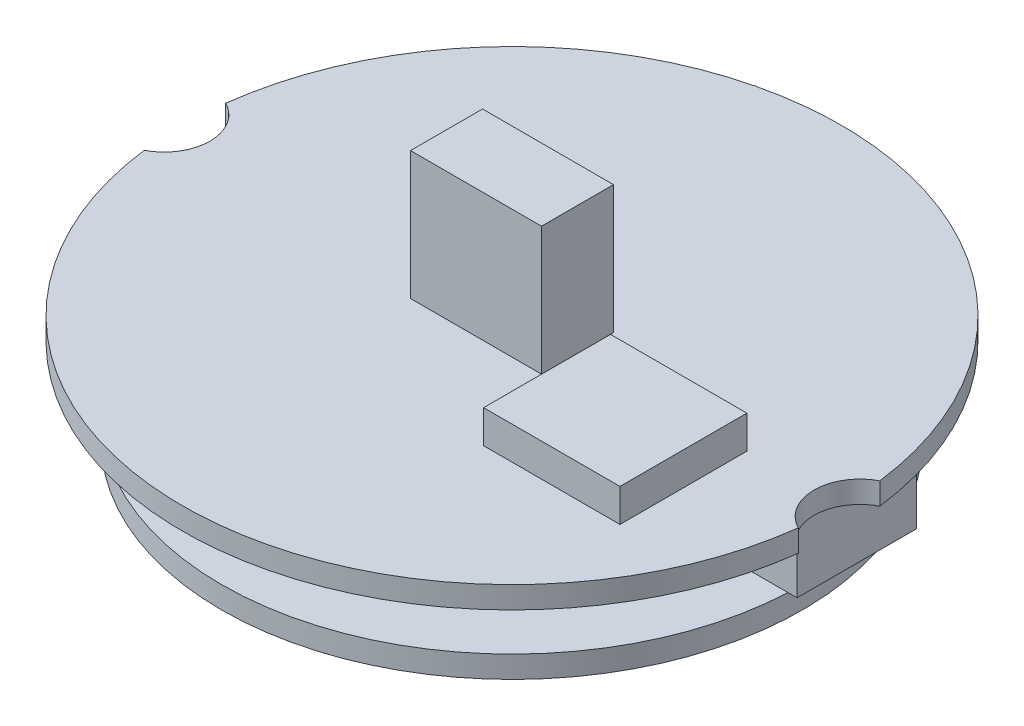
ISO-10303-21;
HEADER;
FILE_DESCRIPTION(('STEP AP214'),'2;1');
FILE_NAME('part.step','',(''),(''),'','','');
FILE_SCHEMA(('AUTOMOTIVE_DESIGN { 1 0 10303 214 1 1 1 1 }'));
ENDSEC;
DATA;
#1=APPLICATION_CONTEXT('core data for automotive mechanical design processes');
#2=APPLICATION_PROTOCOL_DEFINITION('international standard','automotive_design',2000,#1);
#3=PRODUCT_CONTEXT('',#1,'mechanical');
#4=PRODUCT('Part','Part','',(#3));
#5=PRODUCT_RELATED_PRODUCT_CATEGORY('part','',(#4));
#6=PRODUCT_DEFINITION_FORMATION('','',#4);
#7=PRODUCT_DEFINITION_CONTEXT('part definition',#1,'design');
#8=PRODUCT_DEFINITION('design','',#6,#7);
#9=PRODUCT_DEFINITION_SHAPE('','',#8);
#10=(LENGTH_UNIT() NAMED_UNIT(*) SI_UNIT(.MILLI.,.METRE.));
#11=(NAMED_UNIT(*) PLANE_ANGLE_UNIT() SI_UNIT($,.RADIAN.));
#12=(NAMED_UNIT(*) SI_UNIT($,.STERADIAN.) SOLID_ANGLE_UNIT());
#13=UNCERTAINTY_MEASURE_WITH_UNIT(LENGTH_MEASURE(1.E-05),#10,'distance_accuracy_value','');
#14=(GEOMETRIC_REPRESENTATION_CONTEXT(3) GLOBAL_UNCERTAINTY_ASSIGNED_CONTEXT((#13)) GLOBAL_UNIT_ASSIGNED_CONTEXT((#10,
#11,#12)) REPRESENTATION_CONTEXT('',''));
#15=CARTESIAN_POINT('',(0.,0.,0.));
#16=DIRECTION('',(0.,0.,1.));
#17=DIRECTION('',(1.,0.,0.));
#18=AXIS2_PLACEMENT_3D('',#15,#16,#17);
#19=CARTESIAN_POINT('',(0.,3.,0.));
#20=DIRECTION('',(0.,1.,0.));
#21=DIRECTION('',(0.,0.,1.));
#22=AXIS2_PLACEMENT_3D('',#19,#20,#21);
#23=PLANE('',#22);
#24=CARTESIAN_POINT('',(9.5,3.,0.));
#25=DIRECTION('',(0.,1.,0.));
#26=DIRECTION('',(0.,0.,1.));
#27=AXIS2_PLACEMENT_3D('',#24,#25,#26);
#28=CIRCLE('',#27,1.25);
#29=CARTESIAN_POINT('',(8.93092105263158,3.,-1.11294615847401));
#30=VERTEX_POINT('',#29);
#31=CARTESIAN_POINT('',(8.93092105263158,3.,1.11294615847401));
#32=VERTEX_POINT('',#31);
#33=EDGE_CURVE('E189',#30,#32,#28,.T.);
#34=ORIENTED_EDGE('',*,*,#33,.F.);
#35=CARTESIAN_POINT('',(0.,3.,0.));
#36=DIRECTION('',(0.,1.,0.));
#37=DIRECTION('',(0.,0.,1.));
#38=AXIS2_PLACEMENT_3D('',#35,#36,#37);
#39=CIRCLE('',#38,9.);
#40=CARTESIAN_POINT('',(-8.93092105263158,3.,-1.11294615847401));
#41=VERTEX_POINT('',#40);
#42=EDGE_CURVE('E192',#30,#41,#39,.T.);
#43=ORIENTED_EDGE('',*,*,#42,.T.);
#44=CARTESIAN_POINT('',(-9.5,3.,0.));
#45=DIRECTION('',(0.,1.,0.));
#46=DIRECTION('',(0.,0.,1.));
#47=AXIS2_PLACEMENT_3D('',#44,#45,#46);
#48=CIRCLE('',#47,1.25);
#49=CARTESIAN_POINT('',(-8.93092105263158,3.,1.11294615847401));
#50=VERTEX_POINT('',#49);
#51=EDGE_CURVE('E195',#50,#41,#48,.T.);
#52=ORIENTED_EDGE('',*,*,#51,.F.);
#53=EDGE_CURVE('E196',#50,#32,#39,.T.);
#54=ORIENTED_EDGE('',*,*,#53,.T.);
#55=EDGE_LOOP('',(#34,#43,#52,#54));
#56=FACE_BOUND('',#55,.T.);
#57=DIRECTION('',(1.,0.,0.));
#58=VECTOR('',#57,1.);
#59=CARTESIAN_POINT('',(2.69022743306346,3.,3.46625457721637));
#60=LINE('',#59,#58);
#61=CARTESIAN_POINT('',(2.69022743306346,3.,3.46625457721637));
#62=VERTEX_POINT('',#61);
#63=CARTESIAN_POINT('',(6.41515772499748,3.,3.46625457721637));
#64=VERTEX_POINT('',#63);
#65=EDGE_CURVE('E160',#62,#64,#60,.T.);
#66=ORIENTED_EDGE('',*,*,#65,.F.);
#67=DIRECTION('',(0.,0.,1.));
#68=VECTOR('',#67,1.);
#69=CARTESIAN_POINT('',(2.69022743306346,3.,0.));
#70=LINE('',#69,#68);
#71=CARTESIAN_POINT('',(2.69022743306346,3.,0.));
#72=VERTEX_POINT('',#71);
#73=EDGE_CURVE('E157',#72,#62,#70,.T.);
#74=ORIENTED_EDGE('',*,*,#73,.F.);
#75=DIRECTION('',(-1.,0.,0.));
#76=VECTOR('',#75,1.);
#77=CARTESIAN_POINT('',(2.69022743306346,3.,0.));
#78=LINE('',#77,#76);
#79=CARTESIAN_POINT('',(6.41515772499748,3.,0.));
#80=VERTEX_POINT('',#79);
#81=EDGE_CURVE('E169',#80,#72,#78,.T.);
#82=ORIENTED_EDGE('',*,*,#81,.F.);
#83=DIRECTION('',(0.,0.,-1.));
#84=VECTOR('',#83,1.);
#85=CARTESIAN_POINT('',(6.41515772499748,3.,0.));
#86=LINE('',#85,#84);
#87=EDGE_CURVE('E177',#64,#80,#86,.T.);
#88=ORIENTED_EDGE('',*,*,#87,.F.);
#89=EDGE_LOOP('',(#66,#74,#82,#88));
#90=FACE_BOUND('',#89,.T.);
#91=DIRECTION('',(-1.,0.,0.));
#92=VECTOR('',#91,1.);
#93=CARTESIAN_POINT('',(-1.78855779890483,3.,-0.982967715927025));
#94=LINE('',#93,#92);
#95=CARTESIAN_POINT('',(1.78855779890483,3.,-0.982967715927025));
#96=VERTEX_POINT('',#95);
#97=CARTESIAN_POINT('',(-1.78855779890483,3.,-0.982967715927025));
#98=VERTEX_POINT('',#97);
#99=EDGE_CURVE('E376',#96,#98,#94,.T.);
#100=ORIENTED_EDGE('',*,*,#99,.F.);
#101=DIRECTION('',(0.,0.,-1.));
#102=VECTOR('',#101,1.);
#103=CARTESIAN_POINT('',(1.78855779890483,3.,-0.982967715927025));
#104=LINE('',#103,#102);
#105=CARTESIAN_POINT('',(1.78855779890483,3.,0.982967715927025));
#106=VERTEX_POINT('',#105);
#107=EDGE_CURVE('E155',#106,#96,#104,.T.);
#108=ORIENTED_EDGE('',*,*,#107,.F.);
#109=DIRECTION('',(1.,0.,0.));
#110=VECTOR('',#109,1.);
#111=CARTESIAN_POINT('',(-1.78855779890483,3.,0.982967715927025));
#112=LINE('',#111,#110);
#113=CARTESIAN_POINT('',(-1.78855779890483,3.,0.982967715927025));
#114=VERTEX_POINT('',#113);
#115=EDGE_CURVE('E151',#114,#106,#112,.T.);
#116=ORIENTED_EDGE('',*,*,#115,.F.);
#117=DIRECTION('',(0.,0.,1.));
#118=VECTOR('',#117,1.);
#119=CARTESIAN_POINT('',(-1.78855779890483,3.,-0.982967715927025));
#120=LINE('',#119,#118);
#121=EDGE_CURVE('E373',#98,#114,#120,.T.);
#122=ORIENTED_EDGE('',*,*,#121,.F.);
#123=EDGE_LOOP('',(#100,#108,#116,#122));
#124=FACE_BOUND('',#123,.T.);
#125=ADVANCED_FACE('F43',(#56,#90,#124),#23,.T.);
#126=CARTESIAN_POINT('',(9.5,3.,0.));
#127=DIRECTION('',(0.,-1.,0.));
#128=DIRECTION('',(0.,0.,-1.));
#129=AXIS2_PLACEMENT_3D('',#126,#127,#128);
#130=CYLINDRICAL_SURFACE('',#129,1.25);
#131=CARTESIAN_POINT('',(9.5,2.4,0.));
#132=DIRECTION('',(0.,1.,0.));
#133=DIRECTION('',(0.,0.,1.));
#134=AXIS2_PLACEMENT_3D('',#131,#132,#133);
#135=CIRCLE('',#134,1.25);
#136=CARTESIAN_POINT('',(8.93092105263158,2.4,-1.11294615847401));
#137=VERTEX_POINT('',#136);
#138=CARTESIAN_POINT('',(8.93092105263158,2.4,1.11294615847401));
#139=VERTEX_POINT('',#138);
#140=EDGE_CURVE('E188',#137,#139,#135,.T.);
#141=ORIENTED_EDGE('',*,*,#140,.F.);
#142=DIRECTION('',(0.,-1.,0.));
#143=VECTOR('',#142,1.);
#144=CARTESIAN_POINT('',(8.93092105263158,3.,-1.11294615847401));
#145=LINE('',#144,#143);
#146=EDGE_CURVE('E12',#30,#137,#145,.T.);
#147=ORIENTED_EDGE('',*,*,#146,.F.);
#148=ORIENTED_EDGE('',*,*,#33,.T.);
#149=DIRECTION('',(0.,-1.,0.));
#150=VECTOR('',#149,1.);
#151=CARTESIAN_POINT('',(8.93092105263158,3.,1.11294615847401));
#152=LINE('',#151,#150);
#153=EDGE_CURVE('E207',#32,#139,#152,.T.);
#154=ORIENTED_EDGE('',*,*,#153,.T.);
#155=EDGE_LOOP('',(#141,#147,#148,#154));
#156=FACE_BOUND('',#155,.T.);
#157=ADVANCED_FACE('F45',(#156),#130,.F.);
#158=CARTESIAN_POINT('',(0.,3.,0.));
#159=DIRECTION('',(0.,-1.,0.));
#160=DIRECTION('',(0.,0.,-1.));
#161=AXIS2_PLACEMENT_3D('',#158,#159,#160);
#162=CYLINDRICAL_SURFACE('',#161,9.);
#163=CARTESIAN_POINT('',(0.,2.4,0.));
#164=DIRECTION('',(0.,1.,0.));
#165=DIRECTION('',(0.,0.,1.));
#166=AXIS2_PLACEMENT_3D('',#163,#164,#165);
#167=CIRCLE('',#166,9.);
#168=CARTESIAN_POINT('',(-8.93092105263158,2.4,-1.11294615847401));
#169=VERTEX_POINT('',#168);
#170=EDGE_CURVE('E201',#137,#169,#167,.T.);
#171=ORIENTED_EDGE('',*,*,#170,.T.);
#172=DIRECTION('',(0.,-1.,0.));
#173=VECTOR('',#172,1.);
#174=CARTESIAN_POINT('',(-8.93092105263158,3.,-1.11294615847401));
#175=LINE('',#174,#173);
#176=EDGE_CURVE('E51',#41,#169,#175,.T.);
#177=ORIENTED_EDGE('',*,*,#176,.F.);
#178=ORIENTED_EDGE('',*,*,#42,.F.);
#179=ORIENTED_EDGE('',*,*,#146,.T.);
#180=EDGE_LOOP('',(#171,#177,#178,#179));
#181=FACE_BOUND('',#180,.T.);
#182=ADVANCED_FACE('F218',(#181),#162,.T.);
#183=CARTESIAN_POINT('',(-9.5,3.,0.));
#184=DIRECTION('',(0.,-1.,0.));
#185=DIRECTION('',(0.,0.,-1.));
#186=AXIS2_PLACEMENT_3D('',#183,#184,#185);
#187=CYLINDRICAL_SURFACE('',#186,1.25);
#188=CARTESIAN_POINT('',(-9.5,2.4,0.));
#189=DIRECTION('',(0.,1.,0.));
#190=DIRECTION('',(0.,0.,1.));
#191=AXIS2_PLACEMENT_3D('',#188,#189,#190);
#192=CIRCLE('',#191,1.25);
#193=CARTESIAN_POINT('',(-8.93092105263158,2.4,1.11294615847401));
#194=VERTEX_POINT('',#193);
#195=EDGE_CURVE('E204',#194,#169,#192,.T.);
#196=ORIENTED_EDGE('',*,*,#195,.F.);
#197=DIRECTION('',(0.,-1.,0.));
#198=VECTOR('',#197,1.);
#199=CARTESIAN_POINT('',(-8.93092105263158,3.,1.11294615847401));
#200=LINE('',#199,#198);
#201=EDGE_CURVE('E209',#50,#194,#200,.T.);
#202=ORIENTED_EDGE('',*,*,#201,.F.);
#203=ORIENTED_EDGE('',*,*,#51,.T.);
#204=ORIENTED_EDGE('',*,*,#176,.T.);
#205=EDGE_LOOP('',(#196,#202,#203,#204));
#206=FACE_BOUND('',#205,.T.);
#207=ADVANCED_FACE('F213',(#206),#187,.F.);
#208=EDGE_CURVE('E193',#194,#139,#167,.T.);
#209=ORIENTED_EDGE('',*,*,#208,.T.);
#210=ORIENTED_EDGE('',*,*,#153,.F.);
#211=ORIENTED_EDGE('',*,*,#53,.F.);
#212=ORIENTED_EDGE('',*,*,#201,.T.);
#213=EDGE_LOOP('',(#209,#210,#211,#212));
#214=FACE_BOUND('',#213,.T.);
#215=ADVANCED_FACE('F226',(#214),#162,.T.);
#216=CARTESIAN_POINT('',(0.,2.4,0.));
#217=DIRECTION('',(0.,1.,0.));
#218=DIRECTION('',(0.,0.,1.));
#219=AXIS2_PLACEMENT_3D('',#216,#217,#218);
#220=PLANE('',#219);
#221=ORIENTED_EDGE('',*,*,#140,.T.);
#222=ORIENTED_EDGE('',*,*,#208,.F.);
#223=ORIENTED_EDGE('',*,*,#195,.T.);
#224=ORIENTED_EDGE('',*,*,#170,.F.);
#225=EDGE_LOOP('',(#221,#222,#223,#224));
#226=FACE_BOUND('',#225,.T.);
#227=ADVANCED_FACE('F222',(#226),#220,.F.);
#228=CARTESIAN_POINT('',(2.69022743306346,3.9,0.));
#229=DIRECTION('',(1.,0.,0.));
#230=DIRECTION('',(0.,0.,-1.));
#231=AXIS2_PLACEMENT_3D('',#228,#229,#230);
#232=PLANE('',#231);
#233=ORIENTED_EDGE('',*,*,#73,.T.);
#234=DIRECTION('',(0.,-1.,0.));
#235=VECTOR('',#234,1.);
#236=CARTESIAN_POINT('',(2.69022743306346,3.9,3.46625457721637));
#237=LINE('',#236,#235);
#238=CARTESIAN_POINT('',(2.69022743306346,3.9,3.46625457721637));
#239=VERTEX_POINT('',#238);
#240=EDGE_CURVE('E186',#239,#62,#237,.T.);
#241=ORIENTED_EDGE('',*,*,#240,.F.);
#242=DIRECTION('',(0.,0.,1.));
#243=VECTOR('',#242,1.);
#244=CARTESIAN_POINT('',(2.69022743306346,3.9,0.));
#245=LINE('',#244,#243);
#246=CARTESIAN_POINT('',(2.69022743306346,3.9,0.));
#247=VERTEX_POINT('',#246);
#248=EDGE_CURVE('E165',#247,#239,#245,.T.);
#249=ORIENTED_EDGE('',*,*,#248,.F.);
#250=DIRECTION('',(0.,-1.,0.));
#251=VECTOR('',#250,1.);
#252=CARTESIAN_POINT('',(2.69022743306346,3.9,0.));
#253=LINE('',#252,#251);
#254=EDGE_CURVE('E174',#247,#72,#253,.T.);
#255=ORIENTED_EDGE('',*,*,#254,.T.);
#256=EDGE_LOOP('',(#233,#241,#249,#255));
#257=FACE_BOUND('',#256,.T.);
#258=ADVANCED_FACE('F243',(#257),#232,.F.);
#259=CARTESIAN_POINT('',(2.69022743306346,3.9,3.46625457721637));
#260=DIRECTION('',(0.,0.,-1.));
#261=DIRECTION('',(-1.,0.,0.));
#262=AXIS2_PLACEMENT_3D('',#259,#260,#261);
#263=PLANE('',#262);
#264=ORIENTED_EDGE('',*,*,#65,.T.);
#265=DIRECTION('',(0.,-1.,0.));
#266=VECTOR('',#265,1.);
#267=CARTESIAN_POINT('',(6.41515772499748,3.9,3.46625457721637));
#268=LINE('',#267,#266);
#269=CARTESIAN_POINT('',(6.41515772499748,3.9,3.46625457721637));
#270=VERTEX_POINT('',#269);
#271=EDGE_CURVE('E183',#270,#64,#268,.T.);
#272=ORIENTED_EDGE('',*,*,#271,.F.);
#273=DIRECTION('',(1.,0.,0.));
#274=VECTOR('',#273,1.);
#275=CARTESIAN_POINT('',(2.69022743306346,3.9,3.46625457721637));
#276=LINE('',#275,#274);
#277=EDGE_CURVE('E168',#239,#270,#276,.T.);
#278=ORIENTED_EDGE('',*,*,#277,.F.);
#279=ORIENTED_EDGE('',*,*,#240,.T.);
#280=EDGE_LOOP('',(#264,#272,#278,#279));
#281=FACE_BOUND('',#280,.T.);
#282=ADVANCED_FACE('F266',(#281),#263,.F.);
#283=CARTESIAN_POINT('',(6.41515772499748,3.9,0.));
#284=DIRECTION('',(-1.,0.,0.));
#285=DIRECTION('',(0.,0.,1.));
#286=AXIS2_PLACEMENT_3D('',#283,#284,#285);
#287=PLANE('',#286);
#288=ORIENTED_EDGE('',*,*,#87,.T.);
#289=DIRECTION('',(0.,-1.,0.));
#290=VECTOR('',#289,1.);
#291=CARTESIAN_POINT('',(6.41515772499748,3.9,0.));
#292=LINE('',#291,#290);
#293=CARTESIAN_POINT('',(6.41515772499748,3.9,0.));
#294=VERTEX_POINT('',#293);
#295=EDGE_CURVE('E66',#294,#80,#292,.T.);
#296=ORIENTED_EDGE('',*,*,#295,.F.);
#297=DIRECTION('',(0.,0.,-1.));
#298=VECTOR('',#297,1.);
#299=CARTESIAN_POINT('',(6.41515772499748,3.9,0.));
#300=LINE('',#299,#298);
#301=EDGE_CURVE('E171',#270,#294,#300,.T.);
#302=ORIENTED_EDGE('',*,*,#301,.F.);
#303=ORIENTED_EDGE('',*,*,#271,.T.);
#304=EDGE_LOOP('',(#288,#296,#302,#303));
#305=FACE_BOUND('',#304,.T.);
#306=ADVANCED_FACE('F273',(#305),#287,.F.);
#307=CARTESIAN_POINT('',(2.69022743306346,3.9,0.));
#308=DIRECTION('',(0.,0.,1.));
#309=DIRECTION('',(1.,0.,0.));
#310=AXIS2_PLACEMENT_3D('',#307,#308,#309);
#311=PLANE('',#310);
#312=ORIENTED_EDGE('',*,*,#81,.T.);
#313=ORIENTED_EDGE('',*,*,#254,.F.);
#314=DIRECTION('',(-1.,0.,0.));
#315=VECTOR('',#314,1.);
#316=CARTESIAN_POINT('',(2.69022743306346,3.9,0.));
#317=LINE('',#316,#315);
#318=EDGE_CURVE('E173',#294,#247,#317,.T.);
#319=ORIENTED_EDGE('',*,*,#318,.F.);
#320=ORIENTED_EDGE('',*,*,#295,.T.);
#321=EDGE_LOOP('',(#312,#313,#319,#320));
#322=FACE_BOUND('',#321,.T.);
#323=ADVANCED_FACE('F280',(#322),#311,.F.);
#324=CARTESIAN_POINT('',(0.,3.9,0.));
#325=DIRECTION('',(0.,1.,0.));
#326=DIRECTION('',(0.,0.,1.));
#327=AXIS2_PLACEMENT_3D('',#324,#325,#326);
#328=PLANE('',#327);
#329=ORIENTED_EDGE('',*,*,#248,.T.);
#330=ORIENTED_EDGE('',*,*,#277,.T.);
#331=ORIENTED_EDGE('',*,*,#301,.T.);
#332=ORIENTED_EDGE('',*,*,#318,.T.);
#333=EDGE_LOOP('',(#329,#330,#331,#332));
#334=FACE_BOUND('',#333,.T.);
#335=ADVANCED_FACE('F288',(#334),#328,.T.);
#336=CARTESIAN_POINT('',(1.78855779890483,6.5,-0.982967715927025));
#337=DIRECTION('',(-1.,0.,0.));
#338=DIRECTION('',(0.,0.,1.));
#339=AXIS2_PLACEMENT_3D('',#336,#337,#338);
#340=PLANE('',#339);
#341=ORIENTED_EDGE('',*,*,#107,.T.);
#342=DIRECTION('',(0.,-1.,0.));
#343=VECTOR('',#342,1.);
#344=CARTESIAN_POINT('',(1.78855779890483,6.5,-0.982967715927025));
#345=LINE('',#344,#343);
#346=CARTESIAN_POINT('',(1.78855779890483,6.5,-0.982967715927025));
#347=VERTEX_POINT('',#346);
#348=EDGE_CURVE('E136',#347,#96,#345,.T.);
#349=ORIENTED_EDGE('',*,*,#348,.F.);
#350=DIRECTION('',(0.,0.,-1.));
#351=VECTOR('',#350,1.);
#352=CARTESIAN_POINT('',(1.78855779890483,6.5,-0.982967715927025));
#353=LINE('',#352,#351);
#354=CARTESIAN_POINT('',(1.78855779890483,6.5,0.982967715927025));
#355=VERTEX_POINT('',#354);
#356=EDGE_CURVE('E143',#355,#347,#353,.T.);
#357=ORIENTED_EDGE('',*,*,#356,.F.);
#358=DIRECTION('',(0.,-1.,0.));
#359=VECTOR('',#358,1.);
#360=CARTESIAN_POINT('',(1.78855779890483,6.5,0.982967715927025));
#361=LINE('',#360,#359);
#362=EDGE_CURVE('E370',#355,#106,#361,.T.);
#363=ORIENTED_EDGE('',*,*,#362,.T.);
#364=EDGE_LOOP('',(#341,#349,#357,#363));
#365=FACE_BOUND('',#364,.T.);
#366=ADVANCED_FACE('F153',(#365),#340,.F.);
#367=CARTESIAN_POINT('',(-1.78855779890483,6.5,-0.982967715927025));
#368=DIRECTION('',(0.,0.,1.));
#369=DIRECTION('',(1.,0.,0.));
#370=AXIS2_PLACEMENT_3D('',#367,#368,#369);
#371=PLANE('',#370);
#372=ORIENTED_EDGE('',*,*,#99,.T.);
#373=DIRECTION('',(0.,-1.,0.));
#374=VECTOR('',#373,1.);
#375=CARTESIAN_POINT('',(-1.78855779890483,6.5,-0.982967715927025));
#376=LINE('',#375,#374);
#377=CARTESIAN_POINT('',(-1.78855779890483,6.5,-0.982967715927025));
#378=VERTEX_POINT('',#377);
#379=EDGE_CURVE('E139',#378,#98,#376,.T.);
#380=ORIENTED_EDGE('',*,*,#379,.F.);
#381=DIRECTION('',(-1.,0.,0.));
#382=VECTOR('',#381,1.);
#383=CARTESIAN_POINT('',(-1.78855779890483,6.5,-0.982967715927025));
#384=LINE('',#383,#382);
#385=EDGE_CURVE('E132',#347,#378,#384,.T.);
#386=ORIENTED_EDGE('',*,*,#385,.F.);
#387=ORIENTED_EDGE('',*,*,#348,.T.);
#388=EDGE_LOOP('',(#372,#380,#386,#387));
#389=FACE_BOUND('',#388,.T.);
#390=ADVANCED_FACE('F134',(#389),#371,.F.);
#391=CARTESIAN_POINT('',(-1.78855779890483,6.5,-0.982967715927025));
#392=DIRECTION('',(1.,0.,0.));
#393=DIRECTION('',(0.,0.,-1.));
#394=AXIS2_PLACEMENT_3D('',#391,#392,#393);
#395=PLANE('',#394);
#396=ORIENTED_EDGE('',*,*,#121,.T.);
#397=DIRECTION('',(0.,-1.,0.));
#398=VECTOR('',#397,1.);
#399=CARTESIAN_POINT('',(-1.78855779890483,6.5,0.982967715927025));
#400=LINE('',#399,#398);
#401=CARTESIAN_POINT('',(-1.78855779890483,6.5,0.982967715927025));
#402=VERTEX_POINT('',#401);
#403=EDGE_CURVE('E58',#402,#114,#400,.T.);
#404=ORIENTED_EDGE('',*,*,#403,.F.);
#405=DIRECTION('',(0.,0.,1.));
#406=VECTOR('',#405,1.);
#407=CARTESIAN_POINT('',(-1.78855779890483,6.5,-0.982967715927025));
#408=LINE('',#407,#406);
#409=EDGE_CURVE('E142',#378,#402,#408,.T.);
#410=ORIENTED_EDGE('',*,*,#409,.F.);
#411=ORIENTED_EDGE('',*,*,#379,.T.);
#412=EDGE_LOOP('',(#396,#404,#410,#411));
#413=FACE_BOUND('',#412,.T.);
#414=ADVANCED_FACE('F308',(#413),#395,.F.);
#415=CARTESIAN_POINT('',(-1.78855779890483,6.5,0.982967715927025));
#416=DIRECTION('',(0.,0.,-1.));
#417=DIRECTION('',(-1.,0.,0.));
#418=AXIS2_PLACEMENT_3D('',#415,#416,#417);
#419=PLANE('',#418);
#420=ORIENTED_EDGE('',*,*,#115,.T.);
#421=ORIENTED_EDGE('',*,*,#362,.F.);
#422=DIRECTION('',(1.,0.,0.));
#423=VECTOR('',#422,1.);
#424=CARTESIAN_POINT('',(-1.78855779890483,6.5,0.982967715927025));
#425=LINE('',#424,#423);
#426=EDGE_CURVE('E147',#402,#355,#425,.T.);
#427=ORIENTED_EDGE('',*,*,#426,.F.);
#428=ORIENTED_EDGE('',*,*,#403,.T.);
#429=EDGE_LOOP('',(#420,#421,#427,#428));
#430=FACE_BOUND('',#429,.T.);
#431=ADVANCED_FACE('F315',(#430),#419,.F.);
#432=CARTESIAN_POINT('',(0.,6.5,0.));
#433=DIRECTION('',(0.,1.,0.));
#434=DIRECTION('',(0.,0.,1.));
#435=AXIS2_PLACEMENT_3D('',#432,#433,#434);
#436=PLANE('',#435);
#437=ORIENTED_EDGE('',*,*,#356,.T.);
#438=ORIENTED_EDGE('',*,*,#385,.T.);
#439=ORIENTED_EDGE('',*,*,#409,.T.);
#440=ORIENTED_EDGE('',*,*,#426,.T.);
#441=EDGE_LOOP('',(#437,#438,#439,#440));
#442=FACE_BOUND('',#441,.T.);
#443=ADVANCED_FACE('F146',(#442),#436,.T.);
#444=CLOSED_SHELL('',(#125,#157,#182,#207,#215,#227,#258,#282,#306,#323,#335,#366,#390,#414,
#431,#443));
#445=MANIFOLD_SOLID_BREP('B2',#444);
#446=CARTESIAN_POINT('',(0.,0.6,0.));
#447=DIRECTION('',(0.,1.,0.));
#448=DIRECTION('',(0.,0.,1.));
#449=AXIS2_PLACEMENT_3D('',#446,#447,#448);
#450=PLANE('',#449);
#451=DIRECTION('',(1.,0.,0.));
#452=VECTOR('',#451,1.);
#453=CARTESIAN_POINT('',(-8.16762037596635,0.6,0.384011084584314));
#454=LINE('',#453,#452);
#455=CARTESIAN_POINT('',(-7.92096571979345,0.6,0.384011084584314));
#456=VERTEX_POINT('',#455);
#457=CARTESIAN_POINT('',(7.92096571979345,0.6,0.384011084584314));
#458=VERTEX_POINT('',#457);
#459=EDGE_CURVE('E41',#456,#458,#454,.T.);
#460=ORIENTED_EDGE('',*,*,#459,.F.);
#461=CARTESIAN_POINT('',(0.,0.6,0.));
#462=DIRECTION('',(0.,1.,0.));
#463=DIRECTION('',(0.,0.,1.));
#464=AXIS2_PLACEMENT_3D('',#461,#462,#463);
#465=CIRCLE('',#464,7.93026875);
#466=EDGE_CURVE('E475',#456,#458,#465,.T.);
#467=ORIENTED_EDGE('',*,*,#466,.T.);
#468=EDGE_LOOP('',(#460,#467));
#469=FACE_BOUND('',#468,.T.);
#470=ADVANCED_FACE('F394',(#469),#450,.T.);
#471=CARTESIAN_POINT('',(0.,0.6,0.));
#472=DIRECTION('',(0.,-1.,0.));
#473=DIRECTION('',(0.,0.,-1.));
#474=AXIS2_PLACEMENT_3D('',#471,#472,#473);
#475=CYLINDRICAL_SURFACE('',#474,7.93026875);
#476=CARTESIAN_POINT('',(7.38879446095727,0.6,-2.88008313438235));
#477=VERTEX_POINT('',#476);
#478=EDGE_CURVE('E479',#458,#477,#465,.T.);
#479=ORIENTED_EDGE('',*,*,#478,.F.);
#480=ORIENTED_EDGE('',*,*,#466,.F.);
#481=CARTESIAN_POINT('',(-7.38879446095727,0.6,-2.88008313438235));
#482=VERTEX_POINT('',#481);
#483=EDGE_CURVE('E488',#482,#456,#465,.T.);
#484=ORIENTED_EDGE('',*,*,#483,.F.);
#485=EDGE_CURVE('E481',#477,#482,#465,.T.);
#486=ORIENTED_EDGE('',*,*,#485,.F.);
#487=EDGE_LOOP('',(#479,#480,#484,#486));
#488=FACE_BOUND('',#487,.T.);
#489=CARTESIAN_POINT('',(0.,0.,0.));
#490=DIRECTION('',(0.,1.,0.));
#491=DIRECTION('',(0.,0.,1.));
#492=AXIS2_PLACEMENT_3D('',#489,#490,#491);
#493=CIRCLE('',#492,7.93026875);
#494=CARTESIAN_POINT('',(0.,0.,7.93026875));
#495=VERTEX_POINT('',#494);
#496=EDGE_CURVE('E398',#495,#495,#493,.T.);
#497=ORIENTED_EDGE('',*,*,#496,.T.);
#498=EDGE_LOOP('',(#497));
#499=FACE_BOUND('',#498,.T.);
#500=ADVANCED_FACE('F396',(#488,#499),#475,.T.);
#501=DIRECTION('',(-1.,0.,0.));
#502=VECTOR('',#501,1.);
#503=CARTESIAN_POINT('',(-8.16762037596635,0.6,-2.88008313438235));
#504=LINE('',#503,#502);
#505=EDGE_CURVE('E403',#477,#482,#504,.T.);
#506=ORIENTED_EDGE('',*,*,#505,.F.);
#507=ORIENTED_EDGE('',*,*,#485,.T.);
#508=EDGE_LOOP('',(#506,#507));
#509=FACE_BOUND('',#508,.T.);
#510=ADVANCED_FACE('F519',(#509),#450,.T.);
#511=CARTESIAN_POINT('',(0.,0.,0.));
#512=DIRECTION('',(0.,1.,0.));
#513=DIRECTION('',(0.,0.,1.));
#514=AXIS2_PLACEMENT_3D('',#511,#512,#513);
#515=PLANE('',#514);
#516=ORIENTED_EDGE('',*,*,#496,.F.);
#517=EDGE_LOOP('',(#516));
#518=FACE_BOUND('',#517,.T.);
#519=ADVANCED_FACE('F513',(#518),#515,.F.);
#520=CARTESIAN_POINT('',(0.,0.6,0.));
#521=DIRECTION('',(0.,1.,0.));
#522=DIRECTION('',(0.,0.,1.));
#523=AXIS2_PLACEMENT_3D('',#520,#521,#522);
#524=PLANE('',#523);
#525=CARTESIAN_POINT('',(8.16762037596635,0.6,0.384011084584314));
#526=VERTEX_POINT('',#525);
#527=EDGE_CURVE('E406',#458,#526,#454,.T.);
#528=ORIENTED_EDGE('',*,*,#527,.F.);
#529=ORIENTED_EDGE('',*,*,#478,.T.);
#530=CARTESIAN_POINT('',(8.16762037596635,0.6,-2.88008313438235));
#531=VERTEX_POINT('',#530);
#532=EDGE_CURVE('E486',#531,#477,#504,.T.);
#533=ORIENTED_EDGE('',*,*,#532,.F.);
#534=DIRECTION('',(0.,0.,-1.));
#535=VECTOR('',#534,1.);
#536=CARTESIAN_POINT('',(8.16762037596635,0.6,-2.88008313438235));
#537=LINE('',#536,#535);
#538=EDGE_CURVE('E472',#526,#531,#537,.T.);
#539=ORIENTED_EDGE('',*,*,#538,.F.);
#540=EDGE_LOOP('',(#528,#529,#533,#539));
#541=FACE_BOUND('',#540,.T.);
#542=ADVANCED_FACE('F511',(#541),#524,.F.);
#543=CARTESIAN_POINT('',(-8.16762037596635,0.6,-2.88008313438235));
#544=VERTEX_POINT('',#543);
#545=EDGE_CURVE('E487',#482,#544,#504,.T.);
#546=ORIENTED_EDGE('',*,*,#545,.F.);
#547=ORIENTED_EDGE('',*,*,#483,.T.);
#548=CARTESIAN_POINT('',(-8.16762037596635,0.6,0.384011084584314));
#549=VERTEX_POINT('',#548);
#550=EDGE_CURVE('E405',#549,#456,#454,.T.);
#551=ORIENTED_EDGE('',*,*,#550,.F.);
#552=DIRECTION('',(0.,0.,1.));
#553=VECTOR('',#552,1.);
#554=CARTESIAN_POINT('',(-8.16762037596635,0.6,-2.88008313438235));
#555=LINE('',#554,#553);
#556=EDGE_CURVE('E502',#544,#549,#555,.T.);
#557=ORIENTED_EDGE('',*,*,#556,.F.);
#558=EDGE_LOOP('',(#546,#547,#551,#557));
#559=FACE_BOUND('',#558,.T.);
#560=ADVANCED_FACE('F495',(#559),#524,.F.);
#561=CARTESIAN_POINT('',(8.16762037596635,2.4,-2.88008313438235));
#562=DIRECTION('',(-1.,0.,0.));
#563=DIRECTION('',(0.,0.,1.));
#564=AXIS2_PLACEMENT_3D('',#561,#562,#563);
#565=PLANE('',#564);
#566=ORIENTED_EDGE('',*,*,#538,.T.);
#567=DIRECTION('',(0.,-1.,0.));
#568=VECTOR('',#567,1.);
#569=CARTESIAN_POINT('',(8.16762037596635,2.4,-2.88008313438235));
#570=LINE('',#569,#568);
#571=CARTESIAN_POINT('',(8.16762037596635,2.4,-2.88008313438235));
#572=VERTEX_POINT('',#571);
#573=EDGE_CURVE('E453',#572,#531,#570,.T.);
#574=ORIENTED_EDGE('',*,*,#573,.F.);
#575=DIRECTION('',(0.,0.,-1.));
#576=VECTOR('',#575,1.);
#577=CARTESIAN_POINT('',(8.16762037596635,2.4,-2.88008313438235));
#578=LINE('',#577,#576);
#579=CARTESIAN_POINT('',(8.16762037596635,2.4,0.384011084584314));
#580=VERTEX_POINT('',#579);
#581=EDGE_CURVE('E460',#580,#572,#578,.T.);
#582=ORIENTED_EDGE('',*,*,#581,.F.);
#583=DIRECTION('',(0.,-1.,0.));
#584=VECTOR('',#583,1.);
#585=CARTESIAN_POINT('',(8.16762037596635,2.4,0.384011084584314));
#586=LINE('',#585,#584);
#587=EDGE_CURVE('E505',#580,#526,#586,.T.);
#588=ORIENTED_EDGE('',*,*,#587,.T.);
#589=EDGE_LOOP('',(#566,#574,#582,#588));
#590=FACE_BOUND('',#589,.T.);
#591=ADVANCED_FACE('F470',(#590),#565,.F.);
#592=CARTESIAN_POINT('',(-8.16762037596635,2.4,-2.88008313438235));
#593=DIRECTION('',(0.,0.,1.));
#594=DIRECTION('',(1.,0.,0.));
#595=AXIS2_PLACEMENT_3D('',#592,#593,#594);
#596=PLANE('',#595);
#597=ORIENTED_EDGE('',*,*,#532,.T.);
#598=ORIENTED_EDGE('',*,*,#505,.T.);
#599=ORIENTED_EDGE('',*,*,#545,.T.);
#600=DIRECTION('',(0.,-1.,0.));
#601=VECTOR('',#600,1.);
#602=CARTESIAN_POINT('',(-8.16762037596635,2.4,-2.88008313438235));
#603=LINE('',#602,#601);
#604=CARTESIAN_POINT('',(-8.16762037596635,2.4,-2.88008313438235));
#605=VERTEX_POINT('',#604);
#606=EDGE_CURVE('E456',#605,#544,#603,.T.);
#607=ORIENTED_EDGE('',*,*,#606,.F.);
#608=DIRECTION('',(-1.,0.,0.));
#609=VECTOR('',#608,1.);
#610=CARTESIAN_POINT('',(-8.16762037596635,2.4,-2.88008313438235));
#611=LINE('',#610,#609);
#612=EDGE_CURVE('E448',#572,#605,#611,.T.);
#613=ORIENTED_EDGE('',*,*,#612,.F.);
#614=ORIENTED_EDGE('',*,*,#573,.T.);
#615=EDGE_LOOP('',(#597,#598,#599,#607,#613,#614));
#616=FACE_BOUND('',#615,.T.);
#617=ADVANCED_FACE('F451',(#616),#596,.F.);
#618=CARTESIAN_POINT('',(-8.16762037596635,2.4,-2.88008313438235));
#619=DIRECTION('',(1.,0.,0.));
#620=DIRECTION('',(0.,0.,-1.));
#621=AXIS2_PLACEMENT_3D('',#618,#619,#620);
#622=PLANE('',#621);
#623=ORIENTED_EDGE('',*,*,#556,.T.);
#624=DIRECTION('',(0.,-1.,0.));
#625=VECTOR('',#624,1.);
#626=CARTESIAN_POINT('',(-8.16762037596635,2.4,0.384011084584314));
#627=LINE('',#626,#625);
#628=CARTESIAN_POINT('',(-8.16762037596635,2.4,0.384011084584314));
#629=VERTEX_POINT('',#628);
#630=EDGE_CURVE('E476',#629,#549,#627,.T.);
#631=ORIENTED_EDGE('',*,*,#630,.F.);
#632=DIRECTION('',(0.,0.,1.));
#633=VECTOR('',#632,1.);
#634=CARTESIAN_POINT('',(-8.16762037596635,2.4,-2.88008313438235));
#635=LINE('',#634,#633);
#636=EDGE_CURVE('E459',#605,#629,#635,.T.);
#637=ORIENTED_EDGE('',*,*,#636,.F.);
#638=ORIENTED_EDGE('',*,*,#606,.T.);
#639=EDGE_LOOP('',(#623,#631,#637,#638));
#640=FACE_BOUND('',#639,.T.);
#641=ADVANCED_FACE('F510',(#640),#622,.F.);
#642=CARTESIAN_POINT('',(-8.16762037596635,2.4,0.384011084584314));
#643=DIRECTION('',(0.,0.,-1.));
#644=DIRECTION('',(-1.,0.,0.));
#645=AXIS2_PLACEMENT_3D('',#642,#643,#644);
#646=PLANE('',#645);
#647=ORIENTED_EDGE('',*,*,#550,.T.);
#648=ORIENTED_EDGE('',*,*,#459,.T.);
#649=ORIENTED_EDGE('',*,*,#527,.T.);
#650=ORIENTED_EDGE('',*,*,#587,.F.);
#651=DIRECTION('',(1.,0.,0.));
#652=VECTOR('',#651,1.);
#653=CARTESIAN_POINT('',(-8.16762037596635,2.4,0.384011084584314));
#654=LINE('',#653,#652);
#655=EDGE_CURVE('E465',#629,#580,#654,.T.);
#656=ORIENTED_EDGE('',*,*,#655,.F.);
#657=ORIENTED_EDGE('',*,*,#630,.T.);
#658=EDGE_LOOP('',(#647,#648,#649,#650,#656,#657));
#659=FACE_BOUND('',#658,.T.);
#660=ADVANCED_FACE('F500',(#659),#646,.F.);
#661=CARTESIAN_POINT('',(0.,2.4,0.));
#662=DIRECTION('',(0.,1.,0.));
#663=DIRECTION('',(0.,0.,1.));
#664=AXIS2_PLACEMENT_3D('',#661,#662,#663);
#665=PLANE('',#664);
#666=ORIENTED_EDGE('',*,*,#581,.T.);
#667=ORIENTED_EDGE('',*,*,#612,.T.);
#668=ORIENTED_EDGE('',*,*,#636,.T.);
#669=ORIENTED_EDGE('',*,*,#655,.T.);
#670=EDGE_LOOP('',(#666,#667,#668,#669));
#671=FACE_BOUND('',#670,.T.);
#672=ADVANCED_FACE('F463',(#671),#665,.T.);
#673=CLOSED_SHELL('',(#470,#500,#510,#519,#542,#560,#591,#617,#641,#660,#672));
#674=MANIFOLD_SOLID_BREP('B6',#673);
#675=ADVANCED_BREP_SHAPE_REPRESENTATION('',(#18,#445,#674),#14);
#676=SHAPE_DEFINITION_REPRESENTATION(#9,#675);
ENDSEC;
END-ISO-10303-21;
